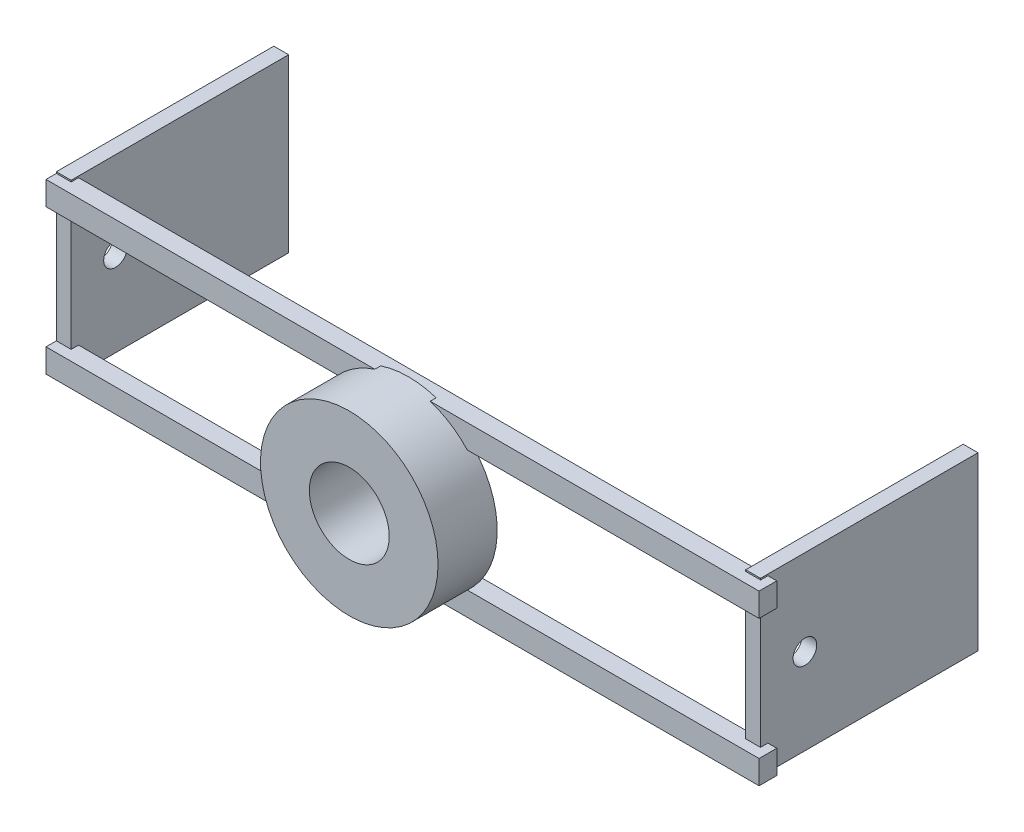
ISO-10303-21;
HEADER;
FILE_DESCRIPTION(('STEP AP214'),'2;1');
FILE_NAME('part.step','',(''),(''),'','','');
FILE_SCHEMA(('AUTOMOTIVE_DESIGN { 1 0 10303 214 1 1 1 1 }'));
ENDSEC;
DATA;
#1=APPLICATION_CONTEXT('core data for automotive mechanical design processes');
#2=APPLICATION_PROTOCOL_DEFINITION('international standard','automotive_design',2000,#1);
#3=PRODUCT_CONTEXT('',#1,'mechanical');
#4=PRODUCT('Part','Part','',(#3));
#5=PRODUCT_RELATED_PRODUCT_CATEGORY('part','',(#4));
#6=PRODUCT_DEFINITION_FORMATION('','',#4);
#7=PRODUCT_DEFINITION_CONTEXT('part definition',#1,'design');
#8=PRODUCT_DEFINITION('design','',#6,#7);
#9=PRODUCT_DEFINITION_SHAPE('','',#8);
#10=(LENGTH_UNIT() NAMED_UNIT(*) SI_UNIT(.MILLI.,.METRE.));
#11=(NAMED_UNIT(*) PLANE_ANGLE_UNIT() SI_UNIT($,.RADIAN.));
#12=(NAMED_UNIT(*) SI_UNIT($,.STERADIAN.) SOLID_ANGLE_UNIT());
#13=UNCERTAINTY_MEASURE_WITH_UNIT(LENGTH_MEASURE(1.E-05),#10,'distance_accuracy_value','');
#14=(GEOMETRIC_REPRESENTATION_CONTEXT(3) GLOBAL_UNCERTAINTY_ASSIGNED_CONTEXT((#13)) GLOBAL_UNIT_ASSIGNED_CONTEXT((#10,
#11,#12)) REPRESENTATION_CONTEXT('',''));
#15=CARTESIAN_POINT('',(0.,0.,0.));
#16=DIRECTION('',(0.,0.,1.));
#17=DIRECTION('',(1.,0.,0.));
#18=AXIS2_PLACEMENT_3D('',#15,#16,#17);
#19=CARTESIAN_POINT('',(59.,341.,194.));
#20=DIRECTION('',(0.,1.,0.));
#21=DIRECTION('',(0.,0.,1.));
#22=AXIS2_PLACEMENT_3D('',#19,#20,#21);
#23=PLANE('',#22);
#24=DIRECTION('',(-1.,0.,0.));
#25=VECTOR('',#24,1.);
#26=CARTESIAN_POINT('',(59.,341.,187.));
#27=LINE('',#26,#25);
#28=CARTESIAN_POINT('',(69.,341.,187.));
#29=VERTEX_POINT('',#28);
#30=CARTESIAN_POINT('',(59.,341.,187.));
#31=VERTEX_POINT('',#30);
#32=EDGE_CURVE('E316',#29,#31,#27,.T.);
#33=ORIENTED_EDGE('',*,*,#32,.F.);
#34=DIRECTION('',(0.,0.,-1.));
#35=VECTOR('',#34,1.);
#36=CARTESIAN_POINT('',(69.,341.,194.));
#37=LINE('',#36,#35);
#38=CARTESIAN_POINT('',(69.,341.,182.));
#39=VERTEX_POINT('',#38);
#40=EDGE_CURVE('E310',#29,#39,#37,.T.);
#41=ORIENTED_EDGE('',*,*,#40,.T.);
#42=DIRECTION('',(1.,0.,0.));
#43=VECTOR('',#42,1.);
#44=CARTESIAN_POINT('',(59.,341.,182.));
#45=LINE('',#44,#43);
#46=CARTESIAN_POINT('',(525.,341.,182.));
#47=VERTEX_POINT('',#46);
#48=EDGE_CURVE('E448',#39,#47,#45,.T.);
#49=ORIENTED_EDGE('',*,*,#48,.T.);
#50=DIRECTION('',(0.,0.,-1.));
#51=VECTOR('',#50,1.);
#52=CARTESIAN_POINT('',(525.,341.,194.));
#53=LINE('',#52,#51);
#54=CARTESIAN_POINT('',(525.,341.,187.));
#55=VERTEX_POINT('',#54);
#56=EDGE_CURVE('E365',#55,#47,#53,.T.);
#57=ORIENTED_EDGE('',*,*,#56,.F.);
#58=DIRECTION('',(-1.,0.,0.));
#59=VECTOR('',#58,1.);
#60=CARTESIAN_POINT('',(59.,341.,187.));
#61=LINE('',#60,#59);
#62=CARTESIAN_POINT('',(535.,341.,187.));
#63=VERTEX_POINT('',#62);
#64=EDGE_CURVE('E384',#63,#55,#61,.T.);
#65=ORIENTED_EDGE('',*,*,#64,.F.);
#66=DIRECTION('',(0.,0.,-1.));
#67=VECTOR('',#66,1.);
#68=CARTESIAN_POINT('',(535.,341.,194.));
#69=LINE('',#68,#67);
#70=CARTESIAN_POINT('',(535.,341.,182.));
#71=VERTEX_POINT('',#70);
#72=EDGE_CURVE('E378',#63,#71,#69,.T.);
#73=ORIENTED_EDGE('',*,*,#72,.T.);
#74=CARTESIAN_POINT('',(541.,341.,182.));
#75=VERTEX_POINT('',#74);
#76=EDGE_CURVE('E433',#71,#75,#45,.T.);
#77=ORIENTED_EDGE('',*,*,#76,.T.);
#78=DIRECTION('',(0.,0.,-1.));
#79=VECTOR('',#78,1.);
#80=CARTESIAN_POINT('',(541.,341.,194.));
#81=LINE('',#80,#79);
#82=CARTESIAN_POINT('',(541.,341.,194.));
#83=VERTEX_POINT('',#82);
#84=EDGE_CURVE('E464',#83,#75,#81,.T.);
#85=ORIENTED_EDGE('',*,*,#84,.F.);
#86=DIRECTION('',(1.,0.,0.));
#87=VECTOR('',#86,1.);
#88=CARTESIAN_POINT('',(59.,341.,194.));
#89=LINE('',#88,#87);
#90=CARTESIAN_POINT('',(343.806392227619,341.,194.));
#91=VERTEX_POINT('',#90);
#92=EDGE_CURVE('E440',#91,#83,#89,.T.);
#93=ORIENTED_EDGE('',*,*,#92,.F.);
#94=DIRECTION('',(0.,0.,-1.));
#95=VECTOR('',#94,1.);
#96=CARTESIAN_POINT('',(343.806392227619,341.,230.));
#97=LINE('',#96,#95);
#98=CARTESIAN_POINT('',(343.806392227619,341.,190.));
#99=VERTEX_POINT('',#98);
#100=EDGE_CURVE('E478',#91,#99,#97,.T.);
#101=ORIENTED_EDGE('',*,*,#100,.T.);
#102=DIRECTION('',(-1.,0.,0.));
#103=VECTOR('',#102,1.);
#104=CARTESIAN_POINT('',(300.,341.,190.));
#105=LINE('',#104,#103);
#106=CARTESIAN_POINT('',(256.193607772381,341.,190.));
#107=VERTEX_POINT('',#106);
#108=EDGE_CURVE('E491',#99,#107,#105,.T.);
#109=ORIENTED_EDGE('',*,*,#108,.T.);
#110=DIRECTION('',(0.,0.,-1.));
#111=VECTOR('',#110,1.);
#112=CARTESIAN_POINT('',(256.193607772381,341.,230.));
#113=LINE('',#112,#111);
#114=CARTESIAN_POINT('',(256.193607772381,341.,194.));
#115=VERTEX_POINT('',#114);
#116=EDGE_CURVE('E471',#107,#115,#113,.F.);
#117=ORIENTED_EDGE('',*,*,#116,.T.);
#118=CARTESIAN_POINT('',(59.,341.,194.));
#119=VERTEX_POINT('',#118);
#120=EDGE_CURVE('E438',#119,#115,#89,.T.);
#121=ORIENTED_EDGE('',*,*,#120,.F.);
#122=DIRECTION('',(0.,0.,-1.));
#123=VECTOR('',#122,1.);
#124=CARTESIAN_POINT('',(59.,341.,194.));
#125=LINE('',#124,#123);
#126=EDGE_CURVE('E463',#119,#31,#125,.T.);
#127=ORIENTED_EDGE('',*,*,#126,.T.);
#128=EDGE_LOOP('',(#33,#41,#49,#57,#65,#73,#77,#85,#93,#101,#109,#117,#121,#127));
#129=FACE_BOUND('',#128,.T.);
#130=ADVANCED_FACE('F39',(#129),#23,.F.);
#131=CARTESIAN_POINT('',(59.,357.,194.));
#132=DIRECTION('',(0.,-1.,0.));
#133=DIRECTION('',(0.,0.,-1.));
#134=AXIS2_PLACEMENT_3D('',#131,#132,#133);
#135=PLANE('',#134);
#136=DIRECTION('',(1.,0.,0.));
#137=VECTOR('',#136,1.);
#138=CARTESIAN_POINT('',(59.,357.,187.));
#139=LINE('',#138,#137);
#140=CARTESIAN_POINT('',(59.,357.,187.));
#141=VERTEX_POINT('',#140);
#142=CARTESIAN_POINT('',(69.,357.,187.));
#143=VERTEX_POINT('',#142);
#144=EDGE_CURVE('E314',#141,#143,#139,.T.);
#145=ORIENTED_EDGE('',*,*,#144,.F.);
#146=DIRECTION('',(0.,0.,-1.));
#147=VECTOR('',#146,1.);
#148=CARTESIAN_POINT('',(59.,357.,194.));
#149=LINE('',#148,#147);
#150=CARTESIAN_POINT('',(59.,357.,194.));
#151=VERTEX_POINT('',#150);
#152=EDGE_CURVE('E450',#151,#141,#149,.T.);
#153=ORIENTED_EDGE('',*,*,#152,.F.);
#154=DIRECTION('',(-1.,0.,0.));
#155=VECTOR('',#154,1.);
#156=CARTESIAN_POINT('',(59.,357.,194.));
#157=LINE('',#156,#155);
#158=CARTESIAN_POINT('',(281.265006004805,357.,194.));
#159=VERTEX_POINT('',#158);
#160=EDGE_CURVE('E441',#159,#151,#157,.T.);
#161=ORIENTED_EDGE('',*,*,#160,.F.);
#162=DIRECTION('',(0.,0.,-1.));
#163=VECTOR('',#162,1.);
#164=CARTESIAN_POINT('',(281.265006004805,357.,230.));
#165=LINE('',#164,#163);
#166=CARTESIAN_POINT('',(281.265006004805,357.,190.));
#167=VERTEX_POINT('',#166);
#168=EDGE_CURVE('E469',#159,#167,#165,.T.);
#169=ORIENTED_EDGE('',*,*,#168,.T.);
#170=DIRECTION('',(1.,0.,0.));
#171=VECTOR('',#170,1.);
#172=CARTESIAN_POINT('',(300.,357.,190.));
#173=LINE('',#172,#171);
#174=CARTESIAN_POINT('',(318.734993995195,357.,190.));
#175=VERTEX_POINT('',#174);
#176=EDGE_CURVE('E483',#167,#175,#173,.T.);
#177=ORIENTED_EDGE('',*,*,#176,.T.);
#178=DIRECTION('',(0.,0.,-1.));
#179=VECTOR('',#178,1.);
#180=CARTESIAN_POINT('',(318.734993995195,357.,230.));
#181=LINE('',#180,#179);
#182=CARTESIAN_POINT('',(318.734993995195,357.,194.));
#183=VERTEX_POINT('',#182);
#184=EDGE_CURVE('E470',#175,#183,#181,.F.);
#185=ORIENTED_EDGE('',*,*,#184,.T.);
#186=CARTESIAN_POINT('',(541.,357.,194.));
#187=VERTEX_POINT('',#186);
#188=EDGE_CURVE('E443',#187,#183,#157,.T.);
#189=ORIENTED_EDGE('',*,*,#188,.F.);
#190=DIRECTION('',(0.,0.,-1.));
#191=VECTOR('',#190,1.);
#192=CARTESIAN_POINT('',(541.,357.,194.));
#193=LINE('',#192,#191);
#194=CARTESIAN_POINT('',(541.,357.,182.));
#195=VERTEX_POINT('',#194);
#196=EDGE_CURVE('E456',#187,#195,#193,.T.);
#197=ORIENTED_EDGE('',*,*,#196,.T.);
#198=DIRECTION('',(-1.,0.,0.));
#199=VECTOR('',#198,1.);
#200=CARTESIAN_POINT('',(59.,357.,182.));
#201=LINE('',#200,#199);
#202=CARTESIAN_POINT('',(535.,357.,182.));
#203=VERTEX_POINT('',#202);
#204=EDGE_CURVE('E437',#195,#203,#201,.T.);
#205=ORIENTED_EDGE('',*,*,#204,.T.);
#206=DIRECTION('',(0.,0.,1.));
#207=VECTOR('',#206,1.);
#208=CARTESIAN_POINT('',(535.,357.,194.));
#209=LINE('',#208,#207);
#210=CARTESIAN_POINT('',(535.,357.,187.));
#211=VERTEX_POINT('',#210);
#212=EDGE_CURVE('E374',#203,#211,#209,.T.);
#213=ORIENTED_EDGE('',*,*,#212,.T.);
#214=DIRECTION('',(1.,0.,0.));
#215=VECTOR('',#214,1.);
#216=CARTESIAN_POINT('',(59.,357.,187.));
#217=LINE('',#216,#215);
#218=CARTESIAN_POINT('',(525.,357.,187.));
#219=VERTEX_POINT('',#218);
#220=EDGE_CURVE('E382',#219,#211,#217,.T.);
#221=ORIENTED_EDGE('',*,*,#220,.F.);
#222=DIRECTION('',(0.,0.,1.));
#223=VECTOR('',#222,1.);
#224=CARTESIAN_POINT('',(525.,357.,194.));
#225=LINE('',#224,#223);
#226=CARTESIAN_POINT('',(525.,357.,182.));
#227=VERTEX_POINT('',#226);
#228=EDGE_CURVE('E362',#227,#219,#225,.T.);
#229=ORIENTED_EDGE('',*,*,#228,.F.);
#230=CARTESIAN_POINT('',(69.,357.,182.));
#231=VERTEX_POINT('',#230);
#232=EDGE_CURVE('E452',#227,#231,#201,.T.);
#233=ORIENTED_EDGE('',*,*,#232,.T.);
#234=DIRECTION('',(0.,0.,1.));
#235=VECTOR('',#234,1.);
#236=CARTESIAN_POINT('',(69.,357.,194.));
#237=LINE('',#236,#235);
#238=EDGE_CURVE('E303',#231,#143,#237,.T.);
#239=ORIENTED_EDGE('',*,*,#238,.T.);
#240=EDGE_LOOP('',(#145,#153,#161,#169,#177,#185,#189,#197,#205,#213,#221,#229,#233,#239));
#241=FACE_BOUND('',#240,.T.);
#242=ADVANCED_FACE('F577',(#241),#135,.F.);
#243=CARTESIAN_POINT('',(59.,243.,194.));
#244=DIRECTION('',(0.,1.,0.));
#245=DIRECTION('',(0.,0.,1.));
#246=AXIS2_PLACEMENT_3D('',#243,#244,#245);
#247=PLANE('',#246);
#248=DIRECTION('',(-1.,0.,0.));
#249=VECTOR('',#248,1.);
#250=CARTESIAN_POINT('',(59.,243.,187.));
#251=LINE('',#250,#249);
#252=CARTESIAN_POINT('',(69.,243.,187.));
#253=VERTEX_POINT('',#252);
#254=CARTESIAN_POINT('',(59.,243.,187.));
#255=VERTEX_POINT('',#254);
#256=EDGE_CURVE('E315',#253,#255,#251,.T.);
#257=ORIENTED_EDGE('',*,*,#256,.F.);
#258=DIRECTION('',(0.,0.,-1.));
#259=VECTOR('',#258,1.);
#260=CARTESIAN_POINT('',(69.,243.,194.));
#261=LINE('',#260,#259);
#262=CARTESIAN_POINT('',(69.,243.,182.));
#263=VERTEX_POINT('',#262);
#264=EDGE_CURVE('E299',#253,#263,#261,.T.);
#265=ORIENTED_EDGE('',*,*,#264,.T.);
#266=DIRECTION('',(1.,0.,0.));
#267=VECTOR('',#266,1.);
#268=CARTESIAN_POINT('',(59.,243.,182.));
#269=LINE('',#268,#267);
#270=CARTESIAN_POINT('',(525.,243.,182.));
#271=VERTEX_POINT('',#270);
#272=EDGE_CURVE('E401',#263,#271,#269,.T.);
#273=ORIENTED_EDGE('',*,*,#272,.T.);
#274=DIRECTION('',(0.,0.,-1.));
#275=VECTOR('',#274,1.);
#276=CARTESIAN_POINT('',(525.,243.,194.));
#277=LINE('',#276,#275);
#278=CARTESIAN_POINT('',(525.,243.,187.));
#279=VERTEX_POINT('',#278);
#280=EDGE_CURVE('E356',#279,#271,#277,.T.);
#281=ORIENTED_EDGE('',*,*,#280,.F.);
#282=DIRECTION('',(-1.,0.,0.));
#283=VECTOR('',#282,1.);
#284=CARTESIAN_POINT('',(59.,243.,187.));
#285=LINE('',#284,#283);
#286=CARTESIAN_POINT('',(535.,243.,187.));
#287=VERTEX_POINT('',#286);
#288=EDGE_CURVE('E381',#287,#279,#285,.T.);
#289=ORIENTED_EDGE('',*,*,#288,.F.);
#290=DIRECTION('',(0.,0.,-1.));
#291=VECTOR('',#290,1.);
#292=CARTESIAN_POINT('',(535.,243.,194.));
#293=LINE('',#292,#291);
#294=CARTESIAN_POINT('',(535.,243.,182.));
#295=VERTEX_POINT('',#294);
#296=EDGE_CURVE('E367',#287,#295,#293,.T.);
#297=ORIENTED_EDGE('',*,*,#296,.T.);
#298=CARTESIAN_POINT('',(541.,243.,182.));
#299=VERTEX_POINT('',#298);
#300=EDGE_CURVE('E390',#295,#299,#269,.T.);
#301=ORIENTED_EDGE('',*,*,#300,.T.);
#302=DIRECTION('',(0.,0.,-1.));
#303=VECTOR('',#302,1.);
#304=CARTESIAN_POINT('',(541.,243.,194.));
#305=LINE('',#304,#303);
#306=CARTESIAN_POINT('',(541.,243.,194.));
#307=VERTEX_POINT('',#306);
#308=EDGE_CURVE('E414',#307,#299,#305,.T.);
#309=ORIENTED_EDGE('',*,*,#308,.F.);
#310=DIRECTION('',(1.,0.,0.));
#311=VECTOR('',#310,1.);
#312=CARTESIAN_POINT('',(59.,243.,194.));
#313=LINE('',#312,#311);
#314=CARTESIAN_POINT('',(318.734993995195,243.,194.));
#315=VERTEX_POINT('',#314);
#316=EDGE_CURVE('E394',#315,#307,#313,.T.);
#317=ORIENTED_EDGE('',*,*,#316,.F.);
#318=DIRECTION('',(0.,0.,-1.));
#319=VECTOR('',#318,1.);
#320=CARTESIAN_POINT('',(318.734993995195,243.,230.));
#321=LINE('',#320,#319);
#322=CARTESIAN_POINT('',(318.734993995195,243.,190.));
#323=VERTEX_POINT('',#322);
#324=EDGE_CURVE('E429',#315,#323,#321,.T.);
#325=ORIENTED_EDGE('',*,*,#324,.T.);
#326=DIRECTION('',(-1.,0.,0.));
#327=VECTOR('',#326,1.);
#328=CARTESIAN_POINT('',(300.,243.,190.));
#329=LINE('',#328,#327);
#330=CARTESIAN_POINT('',(281.265006004805,243.,190.));
#331=VERTEX_POINT('',#330);
#332=EDGE_CURVE('E504',#323,#331,#329,.T.);
#333=ORIENTED_EDGE('',*,*,#332,.T.);
#334=DIRECTION('',(0.,0.,-1.));
#335=VECTOR('',#334,1.);
#336=CARTESIAN_POINT('',(281.265006004805,243.,230.));
#337=LINE('',#336,#335);
#338=CARTESIAN_POINT('',(281.265006004805,243.,194.));
#339=VERTEX_POINT('',#338);
#340=EDGE_CURVE('E430',#331,#339,#337,.F.);
#341=ORIENTED_EDGE('',*,*,#340,.T.);
#342=CARTESIAN_POINT('',(59.,243.,194.));
#343=VERTEX_POINT('',#342);
#344=EDGE_CURVE('E395',#343,#339,#313,.T.);
#345=ORIENTED_EDGE('',*,*,#344,.F.);
#346=DIRECTION('',(0.,0.,-1.));
#347=VECTOR('',#346,1.);
#348=CARTESIAN_POINT('',(59.,243.,194.));
#349=LINE('',#348,#347);
#350=EDGE_CURVE('E416',#343,#255,#349,.T.);
#351=ORIENTED_EDGE('',*,*,#350,.T.);
#352=EDGE_LOOP('',(#257,#265,#273,#281,#289,#297,#301,#309,#317,#325,#333,#341,#345,#351));
#353=FACE_BOUND('',#352,.T.);
#354=ADVANCED_FACE('F529',(#353),#247,.F.);
#355=CARTESIAN_POINT('',(59.,259.,194.));
#356=DIRECTION('',(0.,-1.,0.));
#357=DIRECTION('',(0.,0.,-1.));
#358=AXIS2_PLACEMENT_3D('',#355,#356,#357);
#359=PLANE('',#358);
#360=DIRECTION('',(1.,0.,0.));
#361=VECTOR('',#360,1.);
#362=CARTESIAN_POINT('',(59.,259.,187.));
#363=LINE('',#362,#361);
#364=CARTESIAN_POINT('',(59.,259.,187.));
#365=VERTEX_POINT('',#364);
#366=CARTESIAN_POINT('',(69.,259.,187.));
#367=VERTEX_POINT('',#366);
#368=EDGE_CURVE('E11',#365,#367,#363,.T.);
#369=ORIENTED_EDGE('',*,*,#368,.F.);
#370=DIRECTION('',(0.,0.,-1.));
#371=VECTOR('',#370,1.);
#372=CARTESIAN_POINT('',(59.,259.,194.));
#373=LINE('',#372,#371);
#374=CARTESIAN_POINT('',(59.,259.,194.));
#375=VERTEX_POINT('',#374);
#376=EDGE_CURVE('E405',#375,#365,#373,.T.);
#377=ORIENTED_EDGE('',*,*,#376,.F.);
#378=DIRECTION('',(-1.,0.,0.));
#379=VECTOR('',#378,1.);
#380=CARTESIAN_POINT('',(59.,259.,194.));
#381=LINE('',#380,#379);
#382=CARTESIAN_POINT('',(256.193607772381,259.,194.));
#383=VERTEX_POINT('',#382);
#384=EDGE_CURVE('E397',#383,#375,#381,.T.);
#385=ORIENTED_EDGE('',*,*,#384,.F.);
#386=DIRECTION('',(0.,0.,-1.));
#387=VECTOR('',#386,1.);
#388=CARTESIAN_POINT('',(256.193607772381,259.,230.));
#389=LINE('',#388,#387);
#390=CARTESIAN_POINT('',(256.193607772381,259.,190.));
#391=VERTEX_POINT('',#390);
#392=EDGE_CURVE('E424',#383,#391,#389,.T.);
#393=ORIENTED_EDGE('',*,*,#392,.T.);
#394=DIRECTION('',(1.,0.,0.));
#395=VECTOR('',#394,1.);
#396=CARTESIAN_POINT('',(300.,259.,190.));
#397=LINE('',#396,#395);
#398=CARTESIAN_POINT('',(343.806392227619,259.,190.));
#399=VERTEX_POINT('',#398);
#400=EDGE_CURVE('E499',#391,#399,#397,.T.);
#401=ORIENTED_EDGE('',*,*,#400,.T.);
#402=DIRECTION('',(0.,0.,-1.));
#403=VECTOR('',#402,1.);
#404=CARTESIAN_POINT('',(343.806392227619,259.,230.));
#405=LINE('',#404,#403);
#406=CARTESIAN_POINT('',(343.806392227619,259.,194.));
#407=VERTEX_POINT('',#406);
#408=EDGE_CURVE('E423',#399,#407,#405,.F.);
#409=ORIENTED_EDGE('',*,*,#408,.T.);
#410=CARTESIAN_POINT('',(541.,259.,194.));
#411=VERTEX_POINT('',#410);
#412=EDGE_CURVE('E398',#411,#407,#381,.T.);
#413=ORIENTED_EDGE('',*,*,#412,.F.);
#414=DIRECTION('',(0.,0.,-1.));
#415=VECTOR('',#414,1.);
#416=CARTESIAN_POINT('',(541.,259.,194.));
#417=LINE('',#416,#415);
#418=CARTESIAN_POINT('',(541.,259.,182.));
#419=VERTEX_POINT('',#418);
#420=EDGE_CURVE('E415',#411,#419,#417,.T.);
#421=ORIENTED_EDGE('',*,*,#420,.T.);
#422=DIRECTION('',(-1.,0.,0.));
#423=VECTOR('',#422,1.);
#424=CARTESIAN_POINT('',(59.,259.,182.));
#425=LINE('',#424,#423);
#426=CARTESIAN_POINT('',(535.,259.,182.));
#427=VERTEX_POINT('',#426);
#428=EDGE_CURVE('E391',#419,#427,#425,.T.);
#429=ORIENTED_EDGE('',*,*,#428,.T.);
#430=DIRECTION('',(0.,0.,1.));
#431=VECTOR('',#430,1.);
#432=CARTESIAN_POINT('',(535.,259.,194.));
#433=LINE('',#432,#431);
#434=CARTESIAN_POINT('',(535.,259.,187.));
#435=VERTEX_POINT('',#434);
#436=EDGE_CURVE('E370',#427,#435,#433,.T.);
#437=ORIENTED_EDGE('',*,*,#436,.T.);
#438=DIRECTION('',(1.,0.,0.));
#439=VECTOR('',#438,1.);
#440=CARTESIAN_POINT('',(59.,259.,187.));
#441=LINE('',#440,#439);
#442=CARTESIAN_POINT('',(525.,259.,187.));
#443=VERTEX_POINT('',#442);
#444=EDGE_CURVE('E511',#443,#435,#441,.T.);
#445=ORIENTED_EDGE('',*,*,#444,.F.);
#446=DIRECTION('',(0.,0.,1.));
#447=VECTOR('',#446,1.);
#448=CARTESIAN_POINT('',(525.,259.,194.));
#449=LINE('',#448,#447);
#450=CARTESIAN_POINT('',(525.,259.,182.));
#451=VERTEX_POINT('',#450);
#452=EDGE_CURVE('E353',#451,#443,#449,.T.);
#453=ORIENTED_EDGE('',*,*,#452,.F.);
#454=CARTESIAN_POINT('',(69.,259.,182.));
#455=VERTEX_POINT('',#454);
#456=EDGE_CURVE('E406',#451,#455,#425,.T.);
#457=ORIENTED_EDGE('',*,*,#456,.T.);
#458=DIRECTION('',(0.,0.,1.));
#459=VECTOR('',#458,1.);
#460=CARTESIAN_POINT('',(69.,259.,194.));
#461=LINE('',#460,#459);
#462=EDGE_CURVE('E48',#455,#367,#461,.T.);
#463=ORIENTED_EDGE('',*,*,#462,.T.);
#464=EDGE_LOOP('',(#369,#377,#385,#393,#401,#409,#413,#421,#429,#437,#445,#453,#457,#463));
#465=FACE_BOUND('',#464,.T.);
#466=ADVANCED_FACE('F518',(#465),#359,.F.);
#467=CARTESIAN_POINT('',(0.,0.,182.));
#468=DIRECTION('',(0.,0.,-1.));
#469=DIRECTION('',(-1.,0.,0.));
#470=AXIS2_PLACEMENT_3D('',#467,#468,#469);
#471=PLANE('',#470);
#472=DIRECTION('',(0.,-1.,0.));
#473=VECTOR('',#472,1.);
#474=CARTESIAN_POINT('',(69.,0.,182.));
#475=LINE('',#474,#473);
#476=EDGE_CURVE('E307',#231,#39,#475,.T.);
#477=ORIENTED_EDGE('',*,*,#476,.F.);
#478=ORIENTED_EDGE('',*,*,#232,.F.);
#479=DIRECTION('',(0.,-1.,0.));
#480=VECTOR('',#479,1.);
#481=CARTESIAN_POINT('',(525.,0.,182.));
#482=LINE('',#481,#480);
#483=EDGE_CURVE('E358',#227,#47,#482,.T.);
#484=ORIENTED_EDGE('',*,*,#483,.T.);
#485=ORIENTED_EDGE('',*,*,#48,.F.);
#486=EDGE_LOOP('',(#477,#478,#484,#485));
#487=FACE_BOUND('',#486,.T.);
#488=ADVANCED_FACE('F762',(#487),#471,.T.);
#489=CARTESIAN_POINT('',(0.,0.,182.));
#490=DIRECTION('',(0.,0.,-1.));
#491=DIRECTION('',(-1.,0.,0.));
#492=AXIS2_PLACEMENT_3D('',#489,#490,#491);
#493=PLANE('',#492);
#494=DIRECTION('',(0.,-1.,0.));
#495=VECTOR('',#494,1.);
#496=CARTESIAN_POINT('',(69.,0.,182.));
#497=LINE('',#496,#495);
#498=EDGE_CURVE('E294',#455,#263,#497,.T.);
#499=ORIENTED_EDGE('',*,*,#498,.F.);
#500=ORIENTED_EDGE('',*,*,#456,.F.);
#501=DIRECTION('',(0.,-1.,0.));
#502=VECTOR('',#501,1.);
#503=CARTESIAN_POINT('',(525.,0.,182.));
#504=LINE('',#503,#502);
#505=EDGE_CURVE('E507',#451,#271,#504,.T.);
#506=ORIENTED_EDGE('',*,*,#505,.T.);
#507=ORIENTED_EDGE('',*,*,#272,.F.);
#508=EDGE_LOOP('',(#499,#500,#506,#507));
#509=FACE_BOUND('',#508,.T.);
#510=ADVANCED_FACE('F528',(#509),#493,.T.);
#511=CARTESIAN_POINT('',(300.,300.,230.));
#512=DIRECTION('',(0.,0.,-1.));
#513=DIRECTION('',(-1.,0.,0.));
#514=AXIS2_PLACEMENT_3D('',#511,#512,#513);
#515=CYLINDRICAL_SURFACE('',#514,60.);
#516=CARTESIAN_POINT('',(300.,300.,230.));
#517=DIRECTION('',(0.,0.,1.));
#518=DIRECTION('',(1.,0.,0.));
#519=AXIS2_PLACEMENT_3D('',#516,#517,#518);
#520=CIRCLE('',#519,60.);
#521=CARTESIAN_POINT('',(360.,300.,230.));
#522=VERTEX_POINT('',#521);
#523=EDGE_CURVE('E477',#522,#522,#520,.T.);
#524=ORIENTED_EDGE('',*,*,#523,.F.);
#525=EDGE_LOOP('',(#524));
#526=FACE_BOUND('',#525,.T.);
#527=ORIENTED_EDGE('',*,*,#324,.F.);
#528=CARTESIAN_POINT('',(300.,300.,194.));
#529=DIRECTION('',(0.,0.,-1.));
#530=DIRECTION('',(-1.,0.,0.));
#531=AXIS2_PLACEMENT_3D('',#528,#529,#530);
#532=CIRCLE('',#531,60.);
#533=EDGE_CURVE('E510',#407,#315,#532,.T.);
#534=ORIENTED_EDGE('',*,*,#533,.F.);
#535=ORIENTED_EDGE('',*,*,#408,.F.);
#536=CARTESIAN_POINT('',(300.,300.,190.));
#537=DIRECTION('',(0.,0.,1.));
#538=DIRECTION('',(1.,0.,0.));
#539=AXIS2_PLACEMENT_3D('',#536,#537,#538);
#540=CIRCLE('',#539,60.);
#541=EDGE_CURVE('E479',#399,#99,#540,.T.);
#542=ORIENTED_EDGE('',*,*,#541,.T.);
#543=ORIENTED_EDGE('',*,*,#100,.F.);
#544=CARTESIAN_POINT('',(300.,300.,194.));
#545=DIRECTION('',(0.,0.,-1.));
#546=DIRECTION('',(-1.,0.,0.));
#547=AXIS2_PLACEMENT_3D('',#544,#545,#546);
#548=CIRCLE('',#547,60.);
#549=EDGE_CURVE('E493',#183,#91,#548,.T.);
#550=ORIENTED_EDGE('',*,*,#549,.F.);
#551=ORIENTED_EDGE('',*,*,#184,.F.);
#552=EDGE_CURVE('E482',#175,#167,#540,.T.);
#553=ORIENTED_EDGE('',*,*,#552,.T.);
#554=ORIENTED_EDGE('',*,*,#168,.F.);
#555=EDGE_CURVE('E500',#115,#159,#548,.T.);
#556=ORIENTED_EDGE('',*,*,#555,.F.);
#557=ORIENTED_EDGE('',*,*,#116,.F.);
#558=EDGE_CURVE('E484',#107,#391,#540,.T.);
#559=ORIENTED_EDGE('',*,*,#558,.T.);
#560=ORIENTED_EDGE('',*,*,#392,.F.);
#561=EDGE_CURVE('E503',#339,#383,#532,.T.);
#562=ORIENTED_EDGE('',*,*,#561,.F.);
#563=ORIENTED_EDGE('',*,*,#340,.F.);
#564=EDGE_CURVE('E488',#331,#323,#540,.T.);
#565=ORIENTED_EDGE('',*,*,#564,.T.);
#566=EDGE_LOOP('',(#527,#534,#535,#542,#543,#550,#551,#553,#554,#556,#557,#559,#560,#562,#563,#565));
#567=FACE_BOUND('',#566,.T.);
#568=ADVANCED_FACE('F41',(#526,#567),#515,.T.);
#569=CARTESIAN_POINT('',(300.,300.,190.));
#570=DIRECTION('',(0.,0.,1.));
#571=DIRECTION('',(1.,0.,0.));
#572=AXIS2_PLACEMENT_3D('',#569,#570,#571);
#573=PLANE('',#572);
#574=ORIENTED_EDGE('',*,*,#332,.F.);
#575=ORIENTED_EDGE('',*,*,#564,.F.);
#576=EDGE_LOOP('',(#574,#575));
#577=FACE_BOUND('',#576,.T.);
#578=ADVANCED_FACE('F680',(#577),#573,.F.);
#579=CARTESIAN_POINT('',(300.,300.,190.));
#580=DIRECTION('',(0.,0.,1.));
#581=DIRECTION('',(1.,0.,0.));
#582=AXIS2_PLACEMENT_3D('',#579,#580,#581);
#583=CIRCLE('',#582,27.);
#584=CARTESIAN_POINT('',(327.,300.,190.));
#585=VERTEX_POINT('',#584);
#586=EDGE_CURVE('E622',#585,#585,#583,.T.);
#587=ORIENTED_EDGE('',*,*,#586,.T.);
#588=EDGE_LOOP('',(#587));
#589=FACE_BOUND('',#588,.T.);
#590=ORIENTED_EDGE('',*,*,#400,.F.);
#591=ORIENTED_EDGE('',*,*,#558,.F.);
#592=ORIENTED_EDGE('',*,*,#108,.F.);
#593=ORIENTED_EDGE('',*,*,#541,.F.);
#594=EDGE_LOOP('',(#590,#591,#592,#593));
#595=FACE_BOUND('',#594,.T.);
#596=ADVANCED_FACE('F587',(#589,#595),#573,.F.);
#597=ORIENTED_EDGE('',*,*,#176,.F.);
#598=ORIENTED_EDGE('',*,*,#552,.F.);
#599=EDGE_LOOP('',(#597,#598));
#600=FACE_BOUND('',#599,.T.);
#601=ADVANCED_FACE('F674',(#600),#573,.F.);
#602=CARTESIAN_POINT('',(300.,300.,230.));
#603=DIRECTION('',(0.,0.,1.));
#604=DIRECTION('',(1.,0.,0.));
#605=AXIS2_PLACEMENT_3D('',#602,#603,#604);
#606=PLANE('',#605);
#607=CARTESIAN_POINT('',(300.,300.,230.));
#608=DIRECTION('',(0.,0.,1.));
#609=DIRECTION('',(1.,0.,0.));
#610=AXIS2_PLACEMENT_3D('',#607,#608,#609);
#611=CIRCLE('',#610,27.);
#612=CARTESIAN_POINT('',(327.,300.,230.));
#613=VERTEX_POINT('',#612);
#614=EDGE_CURVE('E621',#613,#613,#611,.T.);
#615=ORIENTED_EDGE('',*,*,#614,.F.);
#616=EDGE_LOOP('',(#615));
#617=FACE_BOUND('',#616,.T.);
#618=ORIENTED_EDGE('',*,*,#523,.T.);
#619=EDGE_LOOP('',(#618));
#620=FACE_BOUND('',#619,.T.);
#621=ADVANCED_FACE('F672',(#617,#620),#606,.T.);
#622=CARTESIAN_POINT('',(0.,0.,194.));
#623=DIRECTION('',(0.,0.,-1.));
#624=DIRECTION('',(-1.,0.,0.));
#625=AXIS2_PLACEMENT_3D('',#622,#623,#624);
#626=PLANE('',#625);
#627=ORIENTED_EDGE('',*,*,#120,.T.);
#628=ORIENTED_EDGE('',*,*,#555,.T.);
#629=ORIENTED_EDGE('',*,*,#160,.T.);
#630=DIRECTION('',(0.,-1.,0.));
#631=VECTOR('',#630,1.);
#632=CARTESIAN_POINT('',(59.,341.,194.));
#633=LINE('',#632,#631);
#634=EDGE_CURVE('E432',#151,#119,#633,.T.);
#635=ORIENTED_EDGE('',*,*,#634,.T.);
#636=EDGE_LOOP('',(#627,#628,#629,#635));
#637=FACE_BOUND('',#636,.T.);
#638=ADVANCED_FACE('F582',(#637),#626,.F.);
#639=CARTESIAN_POINT('',(59.,341.,194.));
#640=DIRECTION('',(1.,0.,0.));
#641=DIRECTION('',(0.,0.,-1.));
#642=AXIS2_PLACEMENT_3D('',#639,#640,#641);
#643=PLANE('',#642);
#644=CARTESIAN_POINT('',(59.,300.,157.));
#645=DIRECTION('',(1.,0.,0.));
#646=DIRECTION('',(0.,0.,-1.));
#647=AXIS2_PLACEMENT_3D('',#644,#645,#646);
#648=CIRCLE('',#647,8.00000000000001);
#649=CARTESIAN_POINT('',(59.,300.,149.));
#650=VERTEX_POINT('',#649);
#651=EDGE_CURVE('E630',#650,#650,#648,.T.);
#652=ORIENTED_EDGE('',*,*,#651,.T.);
#653=EDGE_LOOP('',(#652));
#654=FACE_BOUND('',#653,.T.);
#655=ORIENTED_EDGE('',*,*,#152,.T.);
#656=DIRECTION('',(0.,-1.,0.));
#657=VECTOR('',#656,1.);
#658=CARTESIAN_POINT('',(59.,242.,187.));
#659=LINE('',#658,#657);
#660=CARTESIAN_POINT('',(59.,358.,187.));
#661=VERTEX_POINT('',#660);
#662=EDGE_CURVE('E610',#661,#141,#659,.T.);
#663=ORIENTED_EDGE('',*,*,#662,.F.);
#664=DIRECTION('',(0.,0.,1.));
#665=VECTOR('',#664,1.);
#666=CARTESIAN_POINT('',(59.,358.,40.));
#667=LINE('',#666,#665);
#668=CARTESIAN_POINT('',(59.,358.,40.));
#669=VERTEX_POINT('',#668);
#670=EDGE_CURVE('E604',#669,#661,#667,.T.);
#671=ORIENTED_EDGE('',*,*,#670,.F.);
#672=DIRECTION('',(0.,1.,0.));
#673=VECTOR('',#672,1.);
#674=CARTESIAN_POINT('',(59.,242.,40.));
#675=LINE('',#674,#673);
#676=CARTESIAN_POINT('',(59.,242.,40.));
#677=VERTEX_POINT('',#676);
#678=EDGE_CURVE('E291',#677,#669,#675,.T.);
#679=ORIENTED_EDGE('',*,*,#678,.F.);
#680=DIRECTION('',(0.,0.,-1.));
#681=VECTOR('',#680,1.);
#682=CARTESIAN_POINT('',(59.,242.,40.));
#683=LINE('',#682,#681);
#684=CARTESIAN_POINT('',(59.,242.,187.));
#685=VERTEX_POINT('',#684);
#686=EDGE_CURVE('E288',#685,#677,#683,.T.);
#687=ORIENTED_EDGE('',*,*,#686,.F.);
#688=EDGE_CURVE('E599',#255,#685,#659,.T.);
#689=ORIENTED_EDGE('',*,*,#688,.F.);
#690=ORIENTED_EDGE('',*,*,#350,.F.);
#691=DIRECTION('',(0.,-1.,0.));
#692=VECTOR('',#691,1.);
#693=CARTESIAN_POINT('',(59.,243.,194.));
#694=LINE('',#693,#692);
#695=EDGE_CURVE('E389',#375,#343,#694,.T.);
#696=ORIENTED_EDGE('',*,*,#695,.F.);
#697=ORIENTED_EDGE('',*,*,#376,.T.);
#698=EDGE_CURVE('E603',#31,#365,#659,.T.);
#699=ORIENTED_EDGE('',*,*,#698,.F.);
#700=ORIENTED_EDGE('',*,*,#126,.F.);
#701=ORIENTED_EDGE('',*,*,#634,.F.);
#702=EDGE_LOOP('',(#655,#663,#671,#679,#687,#689,#690,#696,#697,#699,#700,#701));
#703=FACE_BOUND('',#702,.T.);
#704=ADVANCED_FACE('F598',(#654,#703),#643,.F.);
#705=CARTESIAN_POINT('',(541.,341.,194.));
#706=DIRECTION('',(-1.,0.,0.));
#707=DIRECTION('',(0.,0.,1.));
#708=AXIS2_PLACEMENT_3D('',#705,#706,#707);
#709=PLANE('',#708);
#710=DIRECTION('',(0.,1.,0.));
#711=VECTOR('',#710,1.);
#712=CARTESIAN_POINT('',(541.,341.,182.));
#713=LINE('',#712,#711);
#714=EDGE_CURVE('E451',#75,#195,#713,.T.);
#715=ORIENTED_EDGE('',*,*,#714,.T.);
#716=ORIENTED_EDGE('',*,*,#196,.F.);
#717=DIRECTION('',(0.,1.,0.));
#718=VECTOR('',#717,1.);
#719=CARTESIAN_POINT('',(541.,341.,194.));
#720=LINE('',#719,#718);
#721=EDGE_CURVE('E445',#83,#187,#720,.T.);
#722=ORIENTED_EDGE('',*,*,#721,.F.);
#723=ORIENTED_EDGE('',*,*,#84,.T.);
#724=EDGE_LOOP('',(#715,#716,#722,#723));
#725=FACE_BOUND('',#724,.T.);
#726=ADVANCED_FACE('F668',(#725),#709,.F.);
#727=ORIENTED_EDGE('',*,*,#188,.T.);
#728=ORIENTED_EDGE('',*,*,#549,.T.);
#729=ORIENTED_EDGE('',*,*,#92,.T.);
#730=ORIENTED_EDGE('',*,*,#721,.T.);
#731=EDGE_LOOP('',(#727,#728,#729,#730));
#732=FACE_BOUND('',#731,.T.);
#733=ADVANCED_FACE('F700',(#732),#626,.F.);
#734=DIRECTION('',(0.,-1.,0.));
#735=VECTOR('',#734,1.);
#736=CARTESIAN_POINT('',(535.,0.,182.));
#737=LINE('',#736,#735);
#738=EDGE_CURVE('E373',#203,#71,#737,.T.);
#739=ORIENTED_EDGE('',*,*,#738,.F.);
#740=ORIENTED_EDGE('',*,*,#204,.F.);
#741=ORIENTED_EDGE('',*,*,#714,.F.);
#742=ORIENTED_EDGE('',*,*,#76,.F.);
#743=EDGE_LOOP('',(#739,#740,#741,#742));
#744=FACE_BOUND('',#743,.T.);
#745=ADVANCED_FACE('F709',(#744),#471,.T.);
#746=CARTESIAN_POINT('',(0.,0.,194.));
#747=DIRECTION('',(0.,0.,-1.));
#748=DIRECTION('',(-1.,0.,0.));
#749=AXIS2_PLACEMENT_3D('',#746,#747,#748);
#750=PLANE('',#749);
#751=ORIENTED_EDGE('',*,*,#412,.T.);
#752=ORIENTED_EDGE('',*,*,#533,.T.);
#753=ORIENTED_EDGE('',*,*,#316,.T.);
#754=DIRECTION('',(0.,1.,0.));
#755=VECTOR('',#754,1.);
#756=CARTESIAN_POINT('',(541.,243.,194.));
#757=LINE('',#756,#755);
#758=EDGE_CURVE('E396',#307,#411,#757,.T.);
#759=ORIENTED_EDGE('',*,*,#758,.T.);
#760=EDGE_LOOP('',(#751,#752,#753,#759));
#761=FACE_BOUND('',#760,.T.);
#762=ADVANCED_FACE('F563',(#761),#750,.F.);
#763=CARTESIAN_POINT('',(541.,243.,194.));
#764=DIRECTION('',(-1.,0.,0.));
#765=DIRECTION('',(0.,0.,1.));
#766=AXIS2_PLACEMENT_3D('',#763,#764,#765);
#767=PLANE('',#766);
#768=DIRECTION('',(0.,1.,0.));
#769=VECTOR('',#768,1.);
#770=CARTESIAN_POINT('',(541.,243.,182.));
#771=LINE('',#770,#769);
#772=EDGE_CURVE('E403',#299,#419,#771,.T.);
#773=ORIENTED_EDGE('',*,*,#772,.T.);
#774=ORIENTED_EDGE('',*,*,#420,.F.);
#775=ORIENTED_EDGE('',*,*,#758,.F.);
#776=ORIENTED_EDGE('',*,*,#308,.T.);
#777=EDGE_LOOP('',(#773,#774,#775,#776));
#778=FACE_BOUND('',#777,.T.);
#779=ADVANCED_FACE('F557',(#778),#767,.F.);
#780=ORIENTED_EDGE('',*,*,#344,.T.);
#781=ORIENTED_EDGE('',*,*,#561,.T.);
#782=ORIENTED_EDGE('',*,*,#384,.T.);
#783=ORIENTED_EDGE('',*,*,#695,.T.);
#784=EDGE_LOOP('',(#780,#781,#782,#783));
#785=FACE_BOUND('',#784,.T.);
#786=ADVANCED_FACE('F592',(#785),#750,.F.);
#787=DIRECTION('',(0.,-1.,0.));
#788=VECTOR('',#787,1.);
#789=CARTESIAN_POINT('',(535.,0.,182.));
#790=LINE('',#789,#788);
#791=EDGE_CURVE('E512',#427,#295,#790,.T.);
#792=ORIENTED_EDGE('',*,*,#791,.F.);
#793=ORIENTED_EDGE('',*,*,#428,.F.);
#794=ORIENTED_EDGE('',*,*,#772,.F.);
#795=ORIENTED_EDGE('',*,*,#300,.F.);
#796=EDGE_LOOP('',(#792,#793,#794,#795));
#797=FACE_BOUND('',#796,.T.);
#798=ADVANCED_FACE('F551',(#797),#493,.T.);
#799=CARTESIAN_POINT('',(535.,242.,187.));
#800=DIRECTION('',(0.,0.,-1.));
#801=DIRECTION('',(-1.,0.,0.));
#802=AXIS2_PLACEMENT_3D('',#799,#800,#801);
#803=PLANE('',#802);
#804=DIRECTION('',(0.,-1.,0.));
#805=VECTOR('',#804,1.);
#806=CARTESIAN_POINT('',(535.,242.,187.));
#807=LINE('',#806,#805);
#808=EDGE_CURVE('E329',#63,#435,#807,.T.);
#809=ORIENTED_EDGE('',*,*,#808,.F.);
#810=ORIENTED_EDGE('',*,*,#64,.T.);
#811=DIRECTION('',(0.,-1.,0.));
#812=VECTOR('',#811,1.);
#813=CARTESIAN_POINT('',(525.,242.,187.));
#814=LINE('',#813,#812);
#815=EDGE_CURVE('E341',#55,#443,#814,.T.);
#816=ORIENTED_EDGE('',*,*,#815,.T.);
#817=ORIENTED_EDGE('',*,*,#444,.T.);
#818=EDGE_LOOP('',(#809,#810,#816,#817));
#819=FACE_BOUND('',#818,.T.);
#820=ADVANCED_FACE('F542',(#819),#803,.F.);
#821=CARTESIAN_POINT('',(525.,358.,187.));
#822=VERTEX_POINT('',#821);
#823=EDGE_CURVE('E340',#822,#219,#814,.T.);
#824=ORIENTED_EDGE('',*,*,#823,.T.);
#825=ORIENTED_EDGE('',*,*,#220,.T.);
#826=CARTESIAN_POINT('',(535.,358.,187.));
#827=VERTEX_POINT('',#826);
#828=EDGE_CURVE('E326',#827,#211,#807,.T.);
#829=ORIENTED_EDGE('',*,*,#828,.F.);
#830=DIRECTION('',(-1.,0.,0.));
#831=VECTOR('',#830,1.);
#832=CARTESIAN_POINT('',(535.,358.,187.));
#833=LINE('',#832,#831);
#834=EDGE_CURVE('E346',#827,#822,#833,.T.);
#835=ORIENTED_EDGE('',*,*,#834,.T.);
#836=EDGE_LOOP('',(#824,#825,#829,#835));
#837=FACE_BOUND('',#836,.T.);
#838=ADVANCED_FACE('F780',(#837),#803,.F.);
#839=CARTESIAN_POINT('',(535.,242.,187.));
#840=VERTEX_POINT('',#839);
#841=EDGE_CURVE('E324',#287,#840,#807,.T.);
#842=ORIENTED_EDGE('',*,*,#841,.F.);
#843=ORIENTED_EDGE('',*,*,#288,.T.);
#844=CARTESIAN_POINT('',(525.,242.,187.));
#845=VERTEX_POINT('',#844);
#846=EDGE_CURVE('E336',#279,#845,#814,.T.);
#847=ORIENTED_EDGE('',*,*,#846,.T.);
#848=DIRECTION('',(-1.,0.,0.));
#849=VECTOR('',#848,1.);
#850=CARTESIAN_POINT('',(535.,242.,187.));
#851=LINE('',#850,#849);
#852=EDGE_CURVE('E344',#840,#845,#851,.T.);
#853=ORIENTED_EDGE('',*,*,#852,.F.);
#854=EDGE_LOOP('',(#842,#843,#847,#853));
#855=FACE_BOUND('',#854,.T.);
#856=ADVANCED_FACE('F777',(#855),#803,.F.);
#857=CARTESIAN_POINT('',(535.,0.,0.));
#858=DIRECTION('',(1.,0.,0.));
#859=DIRECTION('',(0.,0.,-1.));
#860=AXIS2_PLACEMENT_3D('',#857,#858,#859);
#861=PLANE('',#860);
#862=CARTESIAN_POINT('',(535.,300.,157.));
#863=DIRECTION('',(1.,0.,0.));
#864=DIRECTION('',(0.,0.,-1.));
#865=AXIS2_PLACEMENT_3D('',#862,#863,#864);
#866=CIRCLE('',#865,8.00000000000001);
#867=CARTESIAN_POINT('',(535.,300.,149.));
#868=VERTEX_POINT('',#867);
#869=EDGE_CURVE('E638',#868,#868,#866,.T.);
#870=ORIENTED_EDGE('',*,*,#869,.F.);
#871=EDGE_LOOP('',(#870));
#872=FACE_BOUND('',#871,.T.);
#873=ORIENTED_EDGE('',*,*,#72,.F.);
#874=ORIENTED_EDGE('',*,*,#808,.T.);
#875=ORIENTED_EDGE('',*,*,#436,.F.);
#876=ORIENTED_EDGE('',*,*,#791,.T.);
#877=ORIENTED_EDGE('',*,*,#296,.F.);
#878=ORIENTED_EDGE('',*,*,#841,.T.);
#879=DIRECTION('',(0.,0.,-1.));
#880=VECTOR('',#879,1.);
#881=CARTESIAN_POINT('',(535.,242.,40.));
#882=LINE('',#881,#880);
#883=CARTESIAN_POINT('',(535.,242.,40.));
#884=VERTEX_POINT('',#883);
#885=EDGE_CURVE('E328',#840,#884,#882,.T.);
#886=ORIENTED_EDGE('',*,*,#885,.T.);
#887=DIRECTION('',(0.,1.,0.));
#888=VECTOR('',#887,1.);
#889=CARTESIAN_POINT('',(535.,242.,40.));
#890=LINE('',#889,#888);
#891=CARTESIAN_POINT('',(535.,358.,40.));
#892=VERTEX_POINT('',#891);
#893=EDGE_CURVE('E317',#884,#892,#890,.T.);
#894=ORIENTED_EDGE('',*,*,#893,.T.);
#895=DIRECTION('',(0.,0.,1.));
#896=VECTOR('',#895,1.);
#897=CARTESIAN_POINT('',(535.,358.,40.));
#898=LINE('',#897,#896);
#899=EDGE_CURVE('E325',#892,#827,#898,.T.);
#900=ORIENTED_EDGE('',*,*,#899,.T.);
#901=ORIENTED_EDGE('',*,*,#828,.T.);
#902=ORIENTED_EDGE('',*,*,#212,.F.);
#903=ORIENTED_EDGE('',*,*,#738,.T.);
#904=EDGE_LOOP('',(#873,#874,#875,#876,#877,#878,#886,#894,#900,#901,#902,#903));
#905=FACE_BOUND('',#904,.T.);
#906=ADVANCED_FACE('F552',(#872,#905),#861,.T.);
#907=CARTESIAN_POINT('',(525.,0.,0.));
#908=DIRECTION('',(1.,0.,0.));
#909=DIRECTION('',(0.,0.,-1.));
#910=AXIS2_PLACEMENT_3D('',#907,#908,#909);
#911=PLANE('',#910);
#912=CARTESIAN_POINT('',(525.,300.,157.));
#913=DIRECTION('',(1.,0.,0.));
#914=DIRECTION('',(0.,0.,-1.));
#915=AXIS2_PLACEMENT_3D('',#912,#913,#914);
#916=CIRCLE('',#915,8.00000000000001);
#917=CARTESIAN_POINT('',(525.,300.,149.));
#918=VERTEX_POINT('',#917);
#919=EDGE_CURVE('E632',#918,#918,#916,.T.);
#920=ORIENTED_EDGE('',*,*,#919,.T.);
#921=EDGE_LOOP('',(#920));
#922=FACE_BOUND('',#921,.T.);
#923=ORIENTED_EDGE('',*,*,#815,.F.);
#924=ORIENTED_EDGE('',*,*,#56,.T.);
#925=ORIENTED_EDGE('',*,*,#483,.F.);
#926=ORIENTED_EDGE('',*,*,#228,.T.);
#927=ORIENTED_EDGE('',*,*,#823,.F.);
#928=DIRECTION('',(0.,0.,1.));
#929=VECTOR('',#928,1.);
#930=CARTESIAN_POINT('',(525.,358.,40.));
#931=LINE('',#930,#929);
#932=CARTESIAN_POINT('',(525.,358.,40.));
#933=VERTEX_POINT('',#932);
#934=EDGE_CURVE('E333',#933,#822,#931,.T.);
#935=ORIENTED_EDGE('',*,*,#934,.F.);
#936=DIRECTION('',(0.,1.,0.));
#937=VECTOR('',#936,1.);
#938=CARTESIAN_POINT('',(525.,242.,40.));
#939=LINE('',#938,#937);
#940=CARTESIAN_POINT('',(525.,242.,40.));
#941=VERTEX_POINT('',#940);
#942=EDGE_CURVE('E318',#941,#933,#939,.T.);
#943=ORIENTED_EDGE('',*,*,#942,.F.);
#944=DIRECTION('',(0.,0.,-1.));
#945=VECTOR('',#944,1.);
#946=CARTESIAN_POINT('',(525.,242.,40.));
#947=LINE('',#946,#945);
#948=EDGE_CURVE('E323',#845,#941,#947,.T.);
#949=ORIENTED_EDGE('',*,*,#948,.F.);
#950=ORIENTED_EDGE('',*,*,#846,.F.);
#951=ORIENTED_EDGE('',*,*,#280,.T.);
#952=ORIENTED_EDGE('',*,*,#505,.F.);
#953=ORIENTED_EDGE('',*,*,#452,.T.);
#954=EDGE_LOOP('',(#923,#924,#925,#926,#927,#935,#943,#949,#950,#951,#952,#953));
#955=FACE_BOUND('',#954,.T.);
#956=ADVANCED_FACE('F532',(#922,#955),#911,.F.);
#957=CARTESIAN_POINT('',(535.,242.,40.));
#958=DIRECTION('',(0.,0.,1.));
#959=DIRECTION('',(1.,0.,0.));
#960=AXIS2_PLACEMENT_3D('',#957,#958,#959);
#961=PLANE('',#960);
#962=ORIENTED_EDGE('',*,*,#942,.T.);
#963=DIRECTION('',(-1.,0.,0.));
#964=VECTOR('',#963,1.);
#965=CARTESIAN_POINT('',(535.,358.,40.));
#966=LINE('',#965,#964);
#967=EDGE_CURVE('E354',#892,#933,#966,.T.);
#968=ORIENTED_EDGE('',*,*,#967,.F.);
#969=ORIENTED_EDGE('',*,*,#893,.F.);
#970=DIRECTION('',(-1.,0.,0.));
#971=VECTOR('',#970,1.);
#972=CARTESIAN_POINT('',(535.,242.,40.));
#973=LINE('',#972,#971);
#974=EDGE_CURVE('E335',#884,#941,#973,.T.);
#975=ORIENTED_EDGE('',*,*,#974,.T.);
#976=EDGE_LOOP('',(#962,#968,#969,#975));
#977=FACE_BOUND('',#976,.T.);
#978=ADVANCED_FACE('F815',(#977),#961,.F.);
#979=CARTESIAN_POINT('',(535.,358.,40.));
#980=DIRECTION('',(0.,-1.,0.));
#981=DIRECTION('',(0.,0.,-1.));
#982=AXIS2_PLACEMENT_3D('',#979,#980,#981);
#983=PLANE('',#982);
#984=ORIENTED_EDGE('',*,*,#934,.T.);
#985=ORIENTED_EDGE('',*,*,#834,.F.);
#986=ORIENTED_EDGE('',*,*,#899,.F.);
#987=ORIENTED_EDGE('',*,*,#967,.T.);
#988=EDGE_LOOP('',(#984,#985,#986,#987));
#989=FACE_BOUND('',#988,.T.);
#990=ADVANCED_FACE('F821',(#989),#983,.F.);
#991=CARTESIAN_POINT('',(535.,242.,40.));
#992=DIRECTION('',(0.,1.,0.));
#993=DIRECTION('',(0.,0.,1.));
#994=AXIS2_PLACEMENT_3D('',#991,#992,#993);
#995=PLANE('',#994);
#996=ORIENTED_EDGE('',*,*,#948,.T.);
#997=ORIENTED_EDGE('',*,*,#974,.F.);
#998=ORIENTED_EDGE('',*,*,#885,.F.);
#999=ORIENTED_EDGE('',*,*,#852,.T.);
#1000=EDGE_LOOP('',(#996,#997,#998,#999));
#1001=FACE_BOUND('',#1000,.T.);
#1002=ADVANCED_FACE('F834',(#1001),#995,.F.);
#1003=CARTESIAN_POINT('',(69.,242.,187.));
#1004=DIRECTION('',(0.,0.,-1.));
#1005=DIRECTION('',(-1.,0.,0.));
#1006=AXIS2_PLACEMENT_3D('',#1003,#1004,#1005);
#1007=PLANE('',#1006);
#1008=DIRECTION('',(0.,-1.,0.));
#1009=VECTOR('',#1008,1.);
#1010=CARTESIAN_POINT('',(69.,242.,187.));
#1011=LINE('',#1010,#1009);
#1012=EDGE_CURVE('E61',#29,#367,#1011,.T.);
#1013=ORIENTED_EDGE('',*,*,#1012,.F.);
#1014=ORIENTED_EDGE('',*,*,#32,.T.);
#1015=ORIENTED_EDGE('',*,*,#698,.T.);
#1016=ORIENTED_EDGE('',*,*,#368,.T.);
#1017=EDGE_LOOP('',(#1013,#1014,#1015,#1016));
#1018=FACE_BOUND('',#1017,.T.);
#1019=ADVANCED_FACE('F660',(#1018),#1007,.F.);
#1020=ORIENTED_EDGE('',*,*,#662,.T.);
#1021=ORIENTED_EDGE('',*,*,#144,.T.);
#1022=CARTESIAN_POINT('',(69.,358.,187.));
#1023=VERTEX_POINT('',#1022);
#1024=EDGE_CURVE('E54',#1023,#143,#1011,.T.);
#1025=ORIENTED_EDGE('',*,*,#1024,.F.);
#1026=DIRECTION('',(-1.,0.,0.));
#1027=VECTOR('',#1026,1.);
#1028=CARTESIAN_POINT('',(69.,358.,187.));
#1029=LINE('',#1028,#1027);
#1030=EDGE_CURVE('E279',#1023,#661,#1029,.T.);
#1031=ORIENTED_EDGE('',*,*,#1030,.T.);
#1032=EDGE_LOOP('',(#1020,#1021,#1025,#1031));
#1033=FACE_BOUND('',#1032,.T.);
#1034=ADVANCED_FACE('F654',(#1033),#1007,.F.);
#1035=CARTESIAN_POINT('',(69.,242.,187.));
#1036=VERTEX_POINT('',#1035);
#1037=EDGE_CURVE('E276',#253,#1036,#1011,.T.);
#1038=ORIENTED_EDGE('',*,*,#1037,.F.);
#1039=ORIENTED_EDGE('',*,*,#256,.T.);
#1040=ORIENTED_EDGE('',*,*,#688,.T.);
#1041=DIRECTION('',(-1.,0.,0.));
#1042=VECTOR('',#1041,1.);
#1043=CARTESIAN_POINT('',(69.,242.,187.));
#1044=LINE('',#1043,#1042);
#1045=EDGE_CURVE('E300',#1036,#685,#1044,.T.);
#1046=ORIENTED_EDGE('',*,*,#1045,.F.);
#1047=EDGE_LOOP('',(#1038,#1039,#1040,#1046));
#1048=FACE_BOUND('',#1047,.T.);
#1049=ADVANCED_FACE('F620',(#1048),#1007,.F.);
#1050=CARTESIAN_POINT('',(69.,0.,0.));
#1051=DIRECTION('',(1.,0.,0.));
#1052=DIRECTION('',(0.,0.,-1.));
#1053=AXIS2_PLACEMENT_3D('',#1050,#1051,#1052);
#1054=PLANE('',#1053);
#1055=CARTESIAN_POINT('',(69.,300.,157.));
#1056=DIRECTION('',(1.,0.,0.));
#1057=DIRECTION('',(0.,0.,-1.));
#1058=AXIS2_PLACEMENT_3D('',#1055,#1056,#1057);
#1059=CIRCLE('',#1058,8.00000000000001);
#1060=CARTESIAN_POINT('',(69.,300.,149.));
#1061=VERTEX_POINT('',#1060);
#1062=EDGE_CURVE('E43',#1061,#1061,#1059,.T.);
#1063=ORIENTED_EDGE('',*,*,#1062,.F.);
#1064=EDGE_LOOP('',(#1063));
#1065=FACE_BOUND('',#1064,.T.);
#1066=ORIENTED_EDGE('',*,*,#40,.F.);
#1067=ORIENTED_EDGE('',*,*,#1012,.T.);
#1068=ORIENTED_EDGE('',*,*,#462,.F.);
#1069=ORIENTED_EDGE('',*,*,#498,.T.);
#1070=ORIENTED_EDGE('',*,*,#264,.F.);
#1071=ORIENTED_EDGE('',*,*,#1037,.T.);
#1072=DIRECTION('',(0.,0.,-1.));
#1073=VECTOR('',#1072,1.);
#1074=CARTESIAN_POINT('',(69.,242.,40.));
#1075=LINE('',#1074,#1073);
#1076=CARTESIAN_POINT('',(69.,242.,40.));
#1077=VERTEX_POINT('',#1076);
#1078=EDGE_CURVE('E282',#1036,#1077,#1075,.T.);
#1079=ORIENTED_EDGE('',*,*,#1078,.T.);
#1080=DIRECTION('',(0.,1.,0.));
#1081=VECTOR('',#1080,1.);
#1082=CARTESIAN_POINT('',(69.,242.,40.));
#1083=LINE('',#1082,#1081);
#1084=CARTESIAN_POINT('',(69.,358.,40.));
#1085=VERTEX_POINT('',#1084);
#1086=EDGE_CURVE('E278',#1077,#1085,#1083,.T.);
#1087=ORIENTED_EDGE('',*,*,#1086,.T.);
#1088=DIRECTION('',(0.,0.,1.));
#1089=VECTOR('',#1088,1.);
#1090=CARTESIAN_POINT('',(69.,358.,40.));
#1091=LINE('',#1090,#1089);
#1092=EDGE_CURVE('E271',#1085,#1023,#1091,.T.);
#1093=ORIENTED_EDGE('',*,*,#1092,.T.);
#1094=ORIENTED_EDGE('',*,*,#1024,.T.);
#1095=ORIENTED_EDGE('',*,*,#238,.F.);
#1096=ORIENTED_EDGE('',*,*,#476,.T.);
#1097=EDGE_LOOP('',(#1066,#1067,#1068,#1069,#1070,#1071,#1079,#1087,#1093,#1094,#1095,#1096));
#1098=FACE_BOUND('',#1097,.T.);
#1099=ADVANCED_FACE('F285',(#1065,#1098),#1054,.T.);
#1100=CARTESIAN_POINT('',(69.,242.,40.));
#1101=DIRECTION('',(0.,0.,1.));
#1102=DIRECTION('',(1.,0.,0.));
#1103=AXIS2_PLACEMENT_3D('',#1100,#1101,#1102);
#1104=PLANE('',#1103);
#1105=ORIENTED_EDGE('',*,*,#678,.T.);
#1106=DIRECTION('',(-1.,0.,0.));
#1107=VECTOR('',#1106,1.);
#1108=CARTESIAN_POINT('',(69.,358.,40.));
#1109=LINE('',#1108,#1107);
#1110=EDGE_CURVE('E274',#1085,#669,#1109,.T.);
#1111=ORIENTED_EDGE('',*,*,#1110,.F.);
#1112=ORIENTED_EDGE('',*,*,#1086,.F.);
#1113=DIRECTION('',(-1.,0.,0.));
#1114=VECTOR('',#1113,1.);
#1115=CARTESIAN_POINT('',(69.,242.,40.));
#1116=LINE('',#1115,#1114);
#1117=EDGE_CURVE('E613',#1077,#677,#1116,.T.);
#1118=ORIENTED_EDGE('',*,*,#1117,.T.);
#1119=EDGE_LOOP('',(#1105,#1111,#1112,#1118));
#1120=FACE_BOUND('',#1119,.T.);
#1121=ADVANCED_FACE('F292',(#1120),#1104,.F.);
#1122=CARTESIAN_POINT('',(69.,358.,40.));
#1123=DIRECTION('',(0.,-1.,0.));
#1124=DIRECTION('',(0.,0.,-1.));
#1125=AXIS2_PLACEMENT_3D('',#1122,#1123,#1124);
#1126=PLANE('',#1125);
#1127=ORIENTED_EDGE('',*,*,#670,.T.);
#1128=ORIENTED_EDGE('',*,*,#1030,.F.);
#1129=ORIENTED_EDGE('',*,*,#1092,.F.);
#1130=ORIENTED_EDGE('',*,*,#1110,.T.);
#1131=EDGE_LOOP('',(#1127,#1128,#1129,#1130));
#1132=FACE_BOUND('',#1131,.T.);
#1133=ADVANCED_FACE('F272',(#1132),#1126,.F.);
#1134=CARTESIAN_POINT('',(69.,242.,40.));
#1135=DIRECTION('',(0.,1.,0.));
#1136=DIRECTION('',(0.,0.,1.));
#1137=AXIS2_PLACEMENT_3D('',#1134,#1135,#1136);
#1138=PLANE('',#1137);
#1139=ORIENTED_EDGE('',*,*,#686,.T.);
#1140=ORIENTED_EDGE('',*,*,#1117,.F.);
#1141=ORIENTED_EDGE('',*,*,#1078,.F.);
#1142=ORIENTED_EDGE('',*,*,#1045,.T.);
#1143=EDGE_LOOP('',(#1139,#1140,#1141,#1142));
#1144=FACE_BOUND('',#1143,.T.);
#1145=ADVANCED_FACE('F612',(#1144),#1138,.F.);
#1146=CARTESIAN_POINT('',(300.,300.,20.));
#1147=DIRECTION('',(0.,0.,1.));
#1148=DIRECTION('',(1.,0.,0.));
#1149=AXIS2_PLACEMENT_3D('',#1146,#1147,#1148);
#1150=CYLINDRICAL_SURFACE('',#1149,27.);
#1151=ORIENTED_EDGE('',*,*,#614,.T.);
#1152=EDGE_LOOP('',(#1151));
#1153=FACE_BOUND('',#1152,.T.);
#1154=ORIENTED_EDGE('',*,*,#586,.F.);
#1155=EDGE_LOOP('',(#1154));
#1156=FACE_BOUND('',#1155,.T.);
#1157=ADVANCED_FACE('F925',(#1153,#1156),#1150,.F.);
#1158=CARTESIAN_POINT('',(33.,300.,157.));
#1159=DIRECTION('',(1.,0.,0.));
#1160=DIRECTION('',(0.,0.,-1.));
#1161=AXIS2_PLACEMENT_3D('',#1158,#1159,#1160);
#1162=CYLINDRICAL_SURFACE('',#1161,8.00000000000001);
#1163=ORIENTED_EDGE('',*,*,#1062,.T.);
#1164=EDGE_LOOP('',(#1163));
#1165=FACE_BOUND('',#1164,.T.);
#1166=ORIENTED_EDGE('',*,*,#651,.F.);
#1167=EDGE_LOOP('',(#1166));
#1168=FACE_BOUND('',#1167,.T.);
#1169=ADVANCED_FACE('F641',(#1165,#1168),#1162,.F.);
#1170=ORIENTED_EDGE('',*,*,#869,.T.);
#1171=EDGE_LOOP('',(#1170));
#1172=FACE_BOUND('',#1171,.T.);
#1173=ORIENTED_EDGE('',*,*,#919,.F.);
#1174=EDGE_LOOP('',(#1173));
#1175=FACE_BOUND('',#1174,.T.);
#1176=ADVANCED_FACE('F937',(#1172,#1175),#1162,.F.);
#1177=CLOSED_SHELL('',(#130,#242,#354,#466,#488,#510,#568,#578,#596,#601,#621,#638,#704,#726,
#733,#745,#762,#779,#786,#798,#820,#838,#856,#906,#956,#978,#990,#1002,#1019,#1034,#1049,#1099,
#1121,#1133,#1145,#1157,#1169,#1176));
#1178=MANIFOLD_SOLID_BREP('B2',#1177);
#1179=ADVANCED_BREP_SHAPE_REPRESENTATION('',(#18,#1178),#14);
#1180=SHAPE_DEFINITION_REPRESENTATION(#9,#1179);
ENDSEC;
END-ISO-10303-21;
